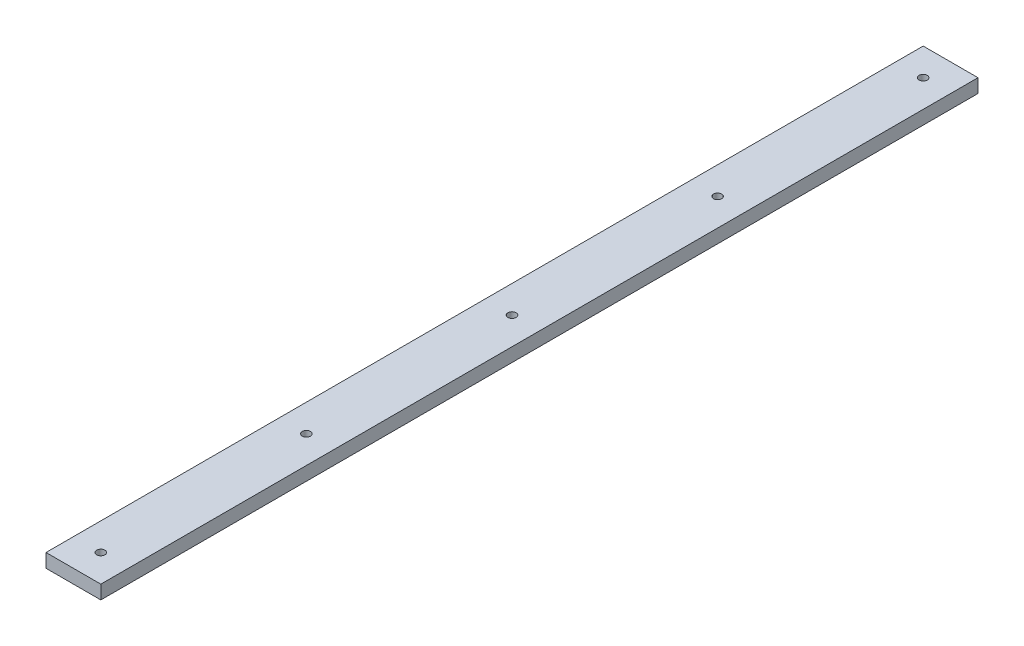
ISO-10303-21;
HEADER;
FILE_DESCRIPTION(('STEP AP214'),'2;1');
FILE_NAME('part.step','',(''),(''),'','','');
FILE_SCHEMA(('AUTOMOTIVE_DESIGN { 1 0 10303 214 1 1 1 1 }'));
ENDSEC;
DATA;
#1=APPLICATION_CONTEXT('core data for automotive mechanical design processes');
#2=APPLICATION_PROTOCOL_DEFINITION('international standard','automotive_design',2000,#1);
#3=PRODUCT_CONTEXT('',#1,'mechanical');
#4=PRODUCT('Part','Part','',(#3));
#5=PRODUCT_RELATED_PRODUCT_CATEGORY('part','',(#4));
#6=PRODUCT_DEFINITION_FORMATION('','',#4);
#7=PRODUCT_DEFINITION_CONTEXT('part definition',#1,'design');
#8=PRODUCT_DEFINITION('design','',#6,#7);
#9=PRODUCT_DEFINITION_SHAPE('','',#8);
#10=(LENGTH_UNIT() NAMED_UNIT(*) SI_UNIT(.MILLI.,.METRE.));
#11=(NAMED_UNIT(*) PLANE_ANGLE_UNIT() SI_UNIT($,.RADIAN.));
#12=(NAMED_UNIT(*) SI_UNIT($,.STERADIAN.) SOLID_ANGLE_UNIT());
#13=UNCERTAINTY_MEASURE_WITH_UNIT(LENGTH_MEASURE(1.E-05),#10,'distance_accuracy_value','');
#14=(GEOMETRIC_REPRESENTATION_CONTEXT(3) GLOBAL_UNCERTAINTY_ASSIGNED_CONTEXT((#13)) GLOBAL_UNIT_ASSIGNED_CONTEXT((#10,
#11,#12)) REPRESENTATION_CONTEXT('',''));
#15=CARTESIAN_POINT('',(0.,0.,0.));
#16=DIRECTION('',(0.,0.,1.));
#17=DIRECTION('',(1.,0.,0.));
#18=AXIS2_PLACEMENT_3D('',#15,#16,#17);
#19=CARTESIAN_POINT('',(3.60822483003176E-13,-5.,-300.000000000001));
#20=DIRECTION('',(0.,1.,0.));
#21=DIRECTION('',(0.,0.,1.));
#22=AXIS2_PLACEMENT_3D('',#19,#20,#21);
#23=CYLINDRICAL_SURFACE('',#22,3.);
#24=CARTESIAN_POINT('',(3.60822483003176E-13,-5.,-300.000000000001));
#25=DIRECTION('',(0.,1.,0.));
#26=DIRECTION('',(0.,0.,1.));
#27=AXIS2_PLACEMENT_3D('',#24,#25,#26);
#28=CIRCLE('',#27,3.);
#29=CARTESIAN_POINT('',(3.60822483003176E-13,-5.,-297.000000000001));
#30=VERTEX_POINT('',#29);
#31=EDGE_CURVE('E49',#30,#30,#28,.T.);
#32=ORIENTED_EDGE('',*,*,#31,.F.);
#33=EDGE_LOOP('',(#32));
#34=FACE_BOUND('',#33,.T.);
#35=CARTESIAN_POINT('',(1.11022302462516E-13,5.,-300.000000000001));
#36=DIRECTION('',(0.,1.,0.));
#37=DIRECTION('',(0.,0.,1.));
#38=AXIS2_PLACEMENT_3D('',#35,#36,#37);
#39=CIRCLE('',#38,3.);
#40=CARTESIAN_POINT('',(1.11022302462516E-13,5.,-297.000000000001));
#41=VERTEX_POINT('',#40);
#42=EDGE_CURVE('E11',#41,#41,#39,.T.);
#43=ORIENTED_EDGE('',*,*,#42,.T.);
#44=EDGE_LOOP('',(#43));
#45=FACE_BOUND('',#44,.T.);
#46=ADVANCED_FACE('F40',(#34,#45),#23,.F.);
#47=CARTESIAN_POINT('',(3.60822483003176E-13,-5.,-150.));
#48=DIRECTION('',(0.,1.,0.));
#49=DIRECTION('',(0.,0.,1.));
#50=AXIS2_PLACEMENT_3D('',#47,#48,#49);
#51=CYLINDRICAL_SURFACE('',#50,3.);
#52=CARTESIAN_POINT('',(3.60822483003176E-13,-5.,-150.));
#53=DIRECTION('',(0.,1.,0.));
#54=DIRECTION('',(0.,0.,1.));
#55=AXIS2_PLACEMENT_3D('',#52,#53,#54);
#56=CIRCLE('',#55,3.);
#57=CARTESIAN_POINT('',(3.60822483003176E-13,-5.,-147.));
#58=VERTEX_POINT('',#57);
#59=EDGE_CURVE('E139',#58,#58,#56,.T.);
#60=ORIENTED_EDGE('',*,*,#59,.F.);
#61=EDGE_LOOP('',(#60));
#62=FACE_BOUND('',#61,.T.);
#63=CARTESIAN_POINT('',(0.,5.,-150.));
#64=DIRECTION('',(0.,1.,0.));
#65=DIRECTION('',(0.,0.,1.));
#66=AXIS2_PLACEMENT_3D('',#63,#64,#65);
#67=CIRCLE('',#66,3.);
#68=CARTESIAN_POINT('',(0.,5.,-147.));
#69=VERTEX_POINT('',#68);
#70=EDGE_CURVE('E143',#69,#69,#67,.T.);
#71=ORIENTED_EDGE('',*,*,#70,.T.);
#72=EDGE_LOOP('',(#71));
#73=FACE_BOUND('',#72,.T.);
#74=ADVANCED_FACE('F155',(#62,#73),#51,.F.);
#75=CARTESIAN_POINT('',(4.71844785465692E-13,-5.,0.));
#76=DIRECTION('',(0.,1.,0.));
#77=DIRECTION('',(0.,0.,1.));
#78=AXIS2_PLACEMENT_3D('',#75,#76,#77);
#79=CYLINDRICAL_SURFACE('',#78,3.);
#80=CARTESIAN_POINT('',(4.71844785465692E-13,-5.,0.));
#81=DIRECTION('',(0.,1.,0.));
#82=DIRECTION('',(0.,0.,1.));
#83=AXIS2_PLACEMENT_3D('',#80,#81,#82);
#84=CIRCLE('',#83,3.);
#85=CARTESIAN_POINT('',(4.71844785465692E-13,-5.,3.));
#86=VERTEX_POINT('',#85);
#87=EDGE_CURVE('E131',#86,#86,#84,.T.);
#88=ORIENTED_EDGE('',*,*,#87,.F.);
#89=EDGE_LOOP('',(#88));
#90=FACE_BOUND('',#89,.T.);
#91=CARTESIAN_POINT('',(0.,5.,0.));
#92=DIRECTION('',(0.,1.,0.));
#93=DIRECTION('',(0.,0.,1.));
#94=AXIS2_PLACEMENT_3D('',#91,#92,#93);
#95=CIRCLE('',#94,3.);
#96=CARTESIAN_POINT('',(0.,5.,3.));
#97=VERTEX_POINT('',#96);
#98=EDGE_CURVE('E135',#97,#97,#95,.T.);
#99=ORIENTED_EDGE('',*,*,#98,.T.);
#100=EDGE_LOOP('',(#99));
#101=FACE_BOUND('',#100,.T.);
#102=ADVANCED_FACE('F182',(#90,#101),#79,.F.);
#103=CARTESIAN_POINT('',(20.0000000000001,5.,319.999999999999));
#104=DIRECTION('',(-1.,0.,0.));
#105=DIRECTION('',(0.,0.,1.));
#106=AXIS2_PLACEMENT_3D('',#103,#104,#105);
#107=PLANE('',#106);
#108=DIRECTION('',(0.,0.,-1.));
#109=VECTOR('',#108,1.);
#110=CARTESIAN_POINT('',(20.0000000000004,-5.,319.999999999999));
#111=LINE('',#110,#109);
#112=CARTESIAN_POINT('',(20.0000000000004,-5.,319.999999999999));
#113=VERTEX_POINT('',#112);
#114=CARTESIAN_POINT('',(20.0000000000004,-5.,-320.000000000001));
#115=VERTEX_POINT('',#114);
#116=EDGE_CURVE('E114',#113,#115,#111,.T.);
#117=ORIENTED_EDGE('',*,*,#116,.T.);
#118=DIRECTION('',(0.,-1.,0.));
#119=VECTOR('',#118,1.);
#120=CARTESIAN_POINT('',(20.0000000000002,5.00000000000001,-320.000000000001));
#121=LINE('',#120,#119);
#122=CARTESIAN_POINT('',(20.0000000000002,5.00000000000001,-320.000000000001));
#123=VERTEX_POINT('',#122);
#124=EDGE_CURVE('E102',#123,#115,#121,.T.);
#125=ORIENTED_EDGE('',*,*,#124,.F.);
#126=DIRECTION('',(0.,0.,-1.));
#127=VECTOR('',#126,1.);
#128=CARTESIAN_POINT('',(20.0000000000001,5.,319.999999999999));
#129=LINE('',#128,#127);
#130=CARTESIAN_POINT('',(20.0000000000001,5.,319.999999999999));
#131=VERTEX_POINT('',#130);
#132=EDGE_CURVE('E94',#131,#123,#129,.T.);
#133=ORIENTED_EDGE('',*,*,#132,.F.);
#134=DIRECTION('',(0.,-1.,0.));
#135=VECTOR('',#134,1.);
#136=CARTESIAN_POINT('',(20.0000000000001,5.,319.999999999999));
#137=LINE('',#136,#135);
#138=EDGE_CURVE('E110',#131,#113,#137,.T.);
#139=ORIENTED_EDGE('',*,*,#138,.T.);
#140=EDGE_LOOP('',(#117,#125,#133,#139));
#141=FACE_BOUND('',#140,.T.);
#142=ADVANCED_FACE('F179',(#141),#107,.F.);
#143=CARTESIAN_POINT('',(-20.,5.,-320.));
#144=DIRECTION('',(0.,0.,1.));
#145=DIRECTION('',(1.,0.,0.));
#146=AXIS2_PLACEMENT_3D('',#143,#144,#145);
#147=PLANE('',#146);
#148=DIRECTION('',(-1.,0.,0.));
#149=VECTOR('',#148,1.);
#150=CARTESIAN_POINT('',(-19.9999999999997,-5.,-320.));
#151=LINE('',#150,#149);
#152=CARTESIAN_POINT('',(-19.9999999999997,-5.,-320.));
#153=VERTEX_POINT('',#152);
#154=EDGE_CURVE('E100',#115,#153,#151,.T.);
#155=ORIENTED_EDGE('',*,*,#154,.T.);
#156=DIRECTION('',(0.,-1.,0.));
#157=VECTOR('',#156,1.);
#158=CARTESIAN_POINT('',(-20.,5.,-320.));
#159=LINE('',#158,#157);
#160=CARTESIAN_POINT('',(-20.,5.,-320.));
#161=VERTEX_POINT('',#160);
#162=EDGE_CURVE('E98',#161,#153,#159,.T.);
#163=ORIENTED_EDGE('',*,*,#162,.F.);
#164=DIRECTION('',(-1.,0.,0.));
#165=VECTOR('',#164,1.);
#166=CARTESIAN_POINT('',(-20.,5.,-320.));
#167=LINE('',#166,#165);
#168=EDGE_CURVE('E88',#123,#161,#167,.T.);
#169=ORIENTED_EDGE('',*,*,#168,.F.);
#170=ORIENTED_EDGE('',*,*,#124,.T.);
#171=EDGE_LOOP('',(#155,#163,#169,#170));
#172=FACE_BOUND('',#171,.T.);
#173=ADVANCED_FACE('F99',(#172),#147,.F.);
#174=CARTESIAN_POINT('',(-19.9999999999999,5.,320.));
#175=DIRECTION('',(1.,0.,0.));
#176=DIRECTION('',(0.,0.,-1.));
#177=AXIS2_PLACEMENT_3D('',#174,#175,#176);
#178=PLANE('',#177);
#179=DIRECTION('',(0.,0.,1.));
#180=VECTOR('',#179,1.);
#181=CARTESIAN_POINT('',(-19.9999999999996,-5.00000000000001,320.));
#182=LINE('',#181,#180);
#183=CARTESIAN_POINT('',(-19.9999999999996,-5.00000000000001,320.));
#184=VERTEX_POINT('',#183);
#185=EDGE_CURVE('E74',#153,#184,#182,.T.);
#186=ORIENTED_EDGE('',*,*,#185,.T.);
#187=DIRECTION('',(0.,-1.,0.));
#188=VECTOR('',#187,1.);
#189=CARTESIAN_POINT('',(-19.9999999999999,5.,320.));
#190=LINE('',#189,#188);
#191=CARTESIAN_POINT('',(-19.9999999999999,5.,320.));
#192=VERTEX_POINT('',#191);
#193=EDGE_CURVE('E103',#192,#184,#190,.T.);
#194=ORIENTED_EDGE('',*,*,#193,.F.);
#195=DIRECTION('',(0.,0.,1.));
#196=VECTOR('',#195,1.);
#197=CARTESIAN_POINT('',(-19.9999999999999,5.,320.));
#198=LINE('',#197,#196);
#199=EDGE_CURVE('E92',#161,#192,#198,.T.);
#200=ORIENTED_EDGE('',*,*,#199,.F.);
#201=ORIENTED_EDGE('',*,*,#162,.T.);
#202=EDGE_LOOP('',(#186,#194,#200,#201));
#203=FACE_BOUND('',#202,.T.);
#204=ADVANCED_FACE('F105',(#203),#178,.F.);
#205=CARTESIAN_POINT('',(-19.9999999999999,5.,320.));
#206=DIRECTION('',(0.,0.,-1.));
#207=DIRECTION('',(-1.,0.,0.));
#208=AXIS2_PLACEMENT_3D('',#205,#206,#207);
#209=PLANE('',#208);
#210=DIRECTION('',(1.,0.,0.));
#211=VECTOR('',#210,1.);
#212=CARTESIAN_POINT('',(-19.9999999999996,-5.00000000000001,320.));
#213=LINE('',#212,#211);
#214=EDGE_CURVE('E80',#184,#113,#213,.T.);
#215=ORIENTED_EDGE('',*,*,#214,.T.);
#216=ORIENTED_EDGE('',*,*,#138,.F.);
#217=DIRECTION('',(1.,0.,0.));
#218=VECTOR('',#217,1.);
#219=CARTESIAN_POINT('',(-19.9999999999999,5.,320.));
#220=LINE('',#219,#218);
#221=EDGE_CURVE('E57',#192,#131,#220,.T.);
#222=ORIENTED_EDGE('',*,*,#221,.F.);
#223=ORIENTED_EDGE('',*,*,#193,.T.);
#224=EDGE_LOOP('',(#215,#216,#222,#223));
#225=FACE_BOUND('',#224,.T.);
#226=ADVANCED_FACE('F159',(#225),#209,.F.);
#227=CARTESIAN_POINT('',(0.,5.,0.));
#228=DIRECTION('',(0.,-1.,0.));
#229=DIRECTION('',(0.,0.,-1.));
#230=AXIS2_PLACEMENT_3D('',#227,#228,#229);
#231=PLANE('',#230);
#232=CARTESIAN_POINT('',(1.11022302462516E-13,5.,150.));
#233=DIRECTION('',(0.,1.,0.));
#234=DIRECTION('',(0.,0.,1.));
#235=AXIS2_PLACEMENT_3D('',#232,#233,#234);
#236=CIRCLE('',#235,3.);
#237=CARTESIAN_POINT('',(1.11022302462516E-13,5.,153.));
#238=VERTEX_POINT('',#237);
#239=EDGE_CURVE('E261',#238,#238,#236,.T.);
#240=ORIENTED_EDGE('',*,*,#239,.F.);
#241=EDGE_LOOP('',(#240));
#242=FACE_BOUND('',#241,.T.);
#243=CARTESIAN_POINT('',(0.,5.,299.999999999999));
#244=DIRECTION('',(0.,1.,0.));
#245=DIRECTION('',(0.,0.,1.));
#246=AXIS2_PLACEMENT_3D('',#243,#244,#245);
#247=CIRCLE('',#246,3.);
#248=CARTESIAN_POINT('',(0.,5.,302.999999999999));
#249=VERTEX_POINT('',#248);
#250=EDGE_CURVE('E263',#249,#249,#247,.T.);
#251=ORIENTED_EDGE('',*,*,#250,.F.);
#252=EDGE_LOOP('',(#251));
#253=FACE_BOUND('',#252,.T.);
#254=ORIENTED_EDGE('',*,*,#132,.T.);
#255=ORIENTED_EDGE('',*,*,#168,.T.);
#256=ORIENTED_EDGE('',*,*,#199,.T.);
#257=ORIENTED_EDGE('',*,*,#221,.T.);
#258=EDGE_LOOP('',(#254,#255,#256,#257));
#259=FACE_BOUND('',#258,.T.);
#260=ORIENTED_EDGE('',*,*,#98,.F.);
#261=EDGE_LOOP('',(#260));
#262=FACE_BOUND('',#261,.T.);
#263=ORIENTED_EDGE('',*,*,#70,.F.);
#264=EDGE_LOOP('',(#263));
#265=FACE_BOUND('',#264,.T.);
#266=ORIENTED_EDGE('',*,*,#42,.F.);
#267=EDGE_LOOP('',(#266));
#268=FACE_BOUND('',#267,.T.);
#269=ADVANCED_FACE('F89',(#242,#253,#259,#262,#265,#268),#231,.F.);
#270=CARTESIAN_POINT('',(4.71844785465692E-13,-5.,0.));
#271=DIRECTION('',(0.,-1.,0.));
#272=DIRECTION('',(0.,0.,-1.));
#273=AXIS2_PLACEMENT_3D('',#270,#271,#272);
#274=PLANE('',#273);
#275=CARTESIAN_POINT('',(3.60822483003176E-13,-5.,150.));
#276=DIRECTION('',(0.,1.,0.));
#277=DIRECTION('',(0.,0.,1.));
#278=AXIS2_PLACEMENT_3D('',#275,#276,#277);
#279=CIRCLE('',#278,3.);
#280=CARTESIAN_POINT('',(3.60822483003176E-13,-5.,153.));
#281=VERTEX_POINT('',#280);
#282=EDGE_CURVE('E259',#281,#281,#279,.T.);
#283=ORIENTED_EDGE('',*,*,#282,.T.);
#284=EDGE_LOOP('',(#283));
#285=FACE_BOUND('',#284,.T.);
#286=CARTESIAN_POINT('',(3.60822483003176E-13,-5.,299.999999999999));
#287=DIRECTION('',(0.,1.,0.));
#288=DIRECTION('',(0.,0.,1.));
#289=AXIS2_PLACEMENT_3D('',#286,#287,#288);
#290=CIRCLE('',#289,3.);
#291=CARTESIAN_POINT('',(3.60822483003176E-13,-5.,302.999999999999));
#292=VERTEX_POINT('',#291);
#293=EDGE_CURVE('E118',#292,#292,#290,.T.);
#294=ORIENTED_EDGE('',*,*,#293,.T.);
#295=EDGE_LOOP('',(#294));
#296=FACE_BOUND('',#295,.T.);
#297=ORIENTED_EDGE('',*,*,#116,.F.);
#298=ORIENTED_EDGE('',*,*,#214,.F.);
#299=ORIENTED_EDGE('',*,*,#185,.F.);
#300=ORIENTED_EDGE('',*,*,#154,.F.);
#301=EDGE_LOOP('',(#297,#298,#299,#300));
#302=FACE_BOUND('',#301,.T.);
#303=ORIENTED_EDGE('',*,*,#87,.T.);
#304=EDGE_LOOP('',(#303));
#305=FACE_BOUND('',#304,.T.);
#306=ORIENTED_EDGE('',*,*,#59,.T.);
#307=EDGE_LOOP('',(#306));
#308=FACE_BOUND('',#307,.T.);
#309=ORIENTED_EDGE('',*,*,#31,.T.);
#310=EDGE_LOOP('',(#309));
#311=FACE_BOUND('',#310,.T.);
#312=ADVANCED_FACE('F151',(#285,#296,#302,#305,#308,#311),#274,.T.);
#313=CARTESIAN_POINT('',(3.60822483003176E-13,-5.,299.999999999999));
#314=DIRECTION('',(0.,1.,0.));
#315=DIRECTION('',(0.,0.,1.));
#316=AXIS2_PLACEMENT_3D('',#313,#314,#315);
#317=CYLINDRICAL_SURFACE('',#316,3.);
#318=ORIENTED_EDGE('',*,*,#293,.F.);
#319=EDGE_LOOP('',(#318));
#320=FACE_BOUND('',#319,.T.);
#321=ORIENTED_EDGE('',*,*,#250,.T.);
#322=EDGE_LOOP('',(#321));
#323=FACE_BOUND('',#322,.T.);
#324=ADVANCED_FACE('F166',(#320,#323),#317,.F.);
#325=CARTESIAN_POINT('',(3.60822483003176E-13,-5.,150.));
#326=DIRECTION('',(0.,1.,0.));
#327=DIRECTION('',(0.,0.,1.));
#328=AXIS2_PLACEMENT_3D('',#325,#326,#327);
#329=CYLINDRICAL_SURFACE('',#328,3.);
#330=ORIENTED_EDGE('',*,*,#282,.F.);
#331=EDGE_LOOP('',(#330));
#332=FACE_BOUND('',#331,.T.);
#333=ORIENTED_EDGE('',*,*,#239,.T.);
#334=EDGE_LOOP('',(#333));
#335=FACE_BOUND('',#334,.T.);
#336=ADVANCED_FACE('F236',(#332,#335),#329,.F.);
#337=CLOSED_SHELL('',(#46,#74,#102,#142,#173,#204,#226,#269,#312,#324,#336));
#338=MANIFOLD_SOLID_BREP('B2',#337);
#339=ADVANCED_BREP_SHAPE_REPRESENTATION('',(#18,#338),#14);
#340=SHAPE_DEFINITION_REPRESENTATION(#9,#339);
ENDSEC;
END-ISO-10303-21;
